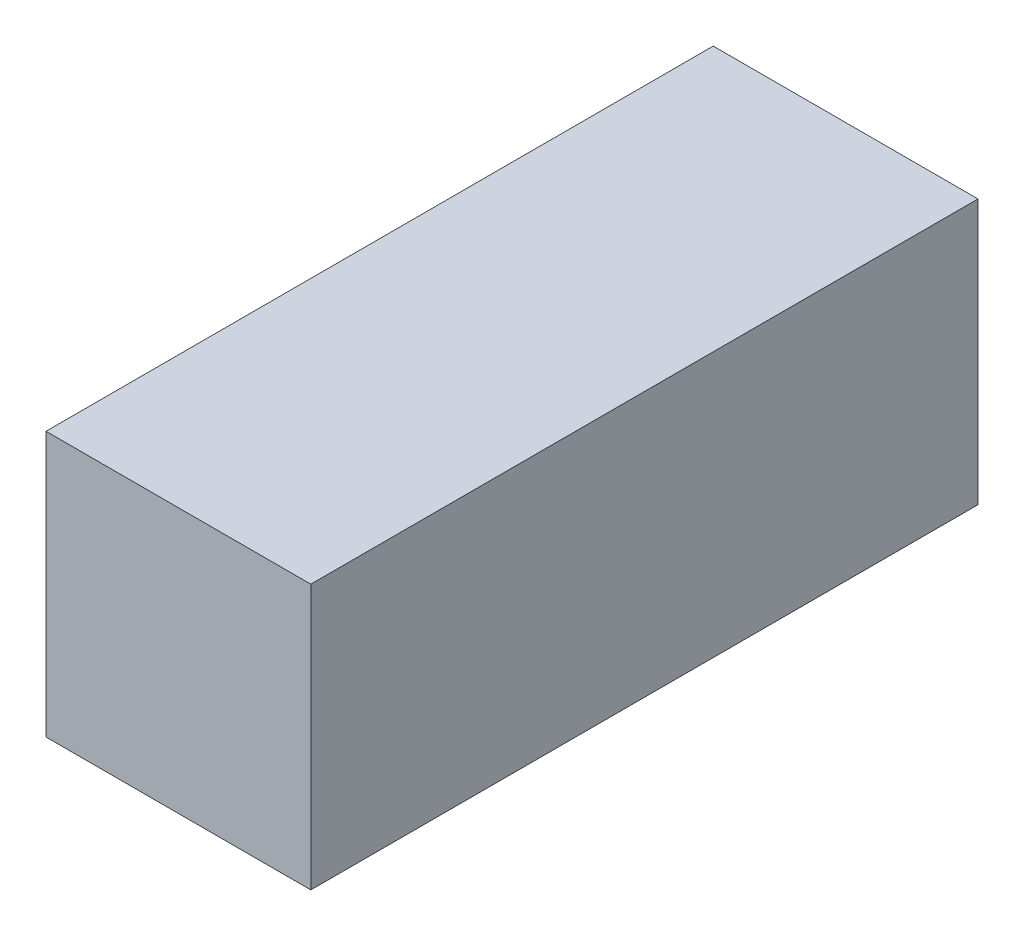
ISO-10303-21;
HEADER;
FILE_DESCRIPTION(('STEP AP214'),'2;1');
FILE_NAME('part.step','',(''),(''),'','','');
FILE_SCHEMA(('AUTOMOTIVE_DESIGN { 1 0 10303 214 1 1 1 1 }'));
ENDSEC;
DATA;
#1=APPLICATION_CONTEXT('core data for automotive mechanical design processes');
#2=APPLICATION_PROTOCOL_DEFINITION('international standard','automotive_design',2000,#1);
#3=PRODUCT_CONTEXT('',#1,'mechanical');
#4=PRODUCT('Part','Part','',(#3));
#5=PRODUCT_RELATED_PRODUCT_CATEGORY('part','',(#4));
#6=PRODUCT_DEFINITION_FORMATION('','',#4);
#7=PRODUCT_DEFINITION_CONTEXT('part definition',#1,'design');
#8=PRODUCT_DEFINITION('design','',#6,#7);
#9=PRODUCT_DEFINITION_SHAPE('','',#8);
#10=(LENGTH_UNIT() NAMED_UNIT(*) SI_UNIT(.MILLI.,.METRE.));
#11=(NAMED_UNIT(*) PLANE_ANGLE_UNIT() SI_UNIT($,.RADIAN.));
#12=(NAMED_UNIT(*) SI_UNIT($,.STERADIAN.) SOLID_ANGLE_UNIT());
#13=UNCERTAINTY_MEASURE_WITH_UNIT(LENGTH_MEASURE(1.E-05),#10,'distance_accuracy_value','');
#14=(GEOMETRIC_REPRESENTATION_CONTEXT(3) GLOBAL_UNCERTAINTY_ASSIGNED_CONTEXT((#13)) GLOBAL_UNIT_ASSIGNED_CONTEXT((#10,
#11,#12)) REPRESENTATION_CONTEXT('',''));
#15=CARTESIAN_POINT('',(0.,0.,0.));
#16=DIRECTION('',(0.,0.,1.));
#17=DIRECTION('',(1.,0.,0.));
#18=AXIS2_PLACEMENT_3D('',#15,#16,#17);
#19=CARTESIAN_POINT('',(8.607,2.2275,-21.));
#20=DIRECTION('',(1.,0.,0.));
#21=DIRECTION('',(0.,0.,-1.));
#22=AXIS2_PLACEMENT_3D('',#19,#20,#21);
#23=PLANE('',#22);
#24=DIRECTION('',(0.,-1.,0.));
#25=VECTOR('',#24,1.);
#26=CARTESIAN_POINT('',(8.607,2.2275,-22.6));
#27=LINE('',#26,#25);
#28=CARTESIAN_POINT('',(8.607,2.2275,-22.6));
#29=VERTEX_POINT('',#28);
#30=CARTESIAN_POINT('',(8.607,1.5925,-22.6));
#31=VERTEX_POINT('',#30);
#32=EDGE_CURVE('E11',#29,#31,#27,.T.);
#33=ORIENTED_EDGE('',*,*,#32,.T.);
#34=DIRECTION('',(0.,0.,-1.));
#35=VECTOR('',#34,1.);
#36=CARTESIAN_POINT('',(8.607,1.5925,-21.));
#37=LINE('',#36,#35);
#38=CARTESIAN_POINT('',(8.607,1.5925,-21.));
#39=VERTEX_POINT('',#38);
#40=EDGE_CURVE('E24',#39,#31,#37,.T.);
#41=ORIENTED_EDGE('',*,*,#40,.F.);
#42=DIRECTION('',(0.,-1.,0.));
#43=VECTOR('',#42,1.);
#44=CARTESIAN_POINT('',(8.607,2.2275,-21.));
#45=LINE('',#44,#43);
#46=CARTESIAN_POINT('',(8.607,2.2275,-21.));
#47=VERTEX_POINT('',#46);
#48=EDGE_CURVE('E88',#47,#39,#45,.T.);
#49=ORIENTED_EDGE('',*,*,#48,.F.);
#50=DIRECTION('',(0.,0.,-1.));
#51=VECTOR('',#50,1.);
#52=CARTESIAN_POINT('',(8.607,2.2275,-21.));
#53=LINE('',#52,#51);
#54=EDGE_CURVE('E77',#47,#29,#53,.T.);
#55=ORIENTED_EDGE('',*,*,#54,.T.);
#56=EDGE_LOOP('',(#33,#41,#49,#55));
#57=FACE_BOUND('',#56,.T.);
#58=ADVANCED_FACE('F17',(#57),#23,.F.);
#59=CARTESIAN_POINT('',(8.607,1.5925,-21.));
#60=DIRECTION('',(0.,1.,0.));
#61=DIRECTION('',(0.,0.,1.));
#62=AXIS2_PLACEMENT_3D('',#59,#60,#61);
#63=PLANE('',#62);
#64=DIRECTION('',(1.,0.,0.));
#65=VECTOR('',#64,1.);
#66=CARTESIAN_POINT('',(8.607,1.5925,-22.6));
#67=LINE('',#66,#65);
#68=CARTESIAN_POINT('',(9.242,1.5925,-22.6));
#69=VERTEX_POINT('',#68);
#70=EDGE_CURVE('E85',#31,#69,#67,.T.);
#71=ORIENTED_EDGE('',*,*,#70,.T.);
#72=DIRECTION('',(0.,0.,-1.));
#73=VECTOR('',#72,1.);
#74=CARTESIAN_POINT('',(9.242,1.5925,-21.));
#75=LINE('',#74,#73);
#76=CARTESIAN_POINT('',(9.242,1.5925,-21.));
#77=VERTEX_POINT('',#76);
#78=EDGE_CURVE('E83',#77,#69,#75,.T.);
#79=ORIENTED_EDGE('',*,*,#78,.F.);
#80=DIRECTION('',(1.,0.,0.));
#81=VECTOR('',#80,1.);
#82=CARTESIAN_POINT('',(8.607,1.5925,-21.));
#83=LINE('',#82,#81);
#84=EDGE_CURVE('E72',#39,#77,#83,.T.);
#85=ORIENTED_EDGE('',*,*,#84,.F.);
#86=ORIENTED_EDGE('',*,*,#40,.T.);
#87=EDGE_LOOP('',(#71,#79,#85,#86));
#88=FACE_BOUND('',#87,.T.);
#89=ADVANCED_FACE('F90',(#88),#63,.F.);
#90=CARTESIAN_POINT('',(9.242,2.2275,-21.));
#91=DIRECTION('',(-1.,0.,0.));
#92=DIRECTION('',(0.,0.,1.));
#93=AXIS2_PLACEMENT_3D('',#90,#91,#92);
#94=PLANE('',#93);
#95=DIRECTION('',(0.,1.,0.));
#96=VECTOR('',#95,1.);
#97=CARTESIAN_POINT('',(9.242,2.2275,-22.6));
#98=LINE('',#97,#96);
#99=CARTESIAN_POINT('',(9.242,2.2275,-22.6));
#100=VERTEX_POINT('',#99);
#101=EDGE_CURVE('E60',#69,#100,#98,.T.);
#102=ORIENTED_EDGE('',*,*,#101,.T.);
#103=DIRECTION('',(0.,0.,-1.));
#104=VECTOR('',#103,1.);
#105=CARTESIAN_POINT('',(9.242,2.2275,-21.));
#106=LINE('',#105,#104);
#107=CARTESIAN_POINT('',(9.242,2.2275,-21.));
#108=VERTEX_POINT('',#107);
#109=EDGE_CURVE('E54',#108,#100,#106,.T.);
#110=ORIENTED_EDGE('',*,*,#109,.F.);
#111=DIRECTION('',(0.,1.,0.));
#112=VECTOR('',#111,1.);
#113=CARTESIAN_POINT('',(9.242,2.2275,-21.));
#114=LINE('',#113,#112);
#115=EDGE_CURVE('E58',#77,#108,#114,.T.);
#116=ORIENTED_EDGE('',*,*,#115,.F.);
#117=ORIENTED_EDGE('',*,*,#78,.T.);
#118=EDGE_LOOP('',(#102,#110,#116,#117));
#119=FACE_BOUND('',#118,.T.);
#120=ADVANCED_FACE('F56',(#119),#94,.F.);
#121=CARTESIAN_POINT('',(8.607,2.2275,-21.));
#122=DIRECTION('',(0.,-1.,0.));
#123=DIRECTION('',(0.,0.,-1.));
#124=AXIS2_PLACEMENT_3D('',#121,#122,#123);
#125=PLANE('',#124);
#126=DIRECTION('',(-1.,0.,0.));
#127=VECTOR('',#126,1.);
#128=CARTESIAN_POINT('',(8.607,2.2275,-22.6));
#129=LINE('',#128,#127);
#130=EDGE_CURVE('E73',#100,#29,#129,.T.);
#131=ORIENTED_EDGE('',*,*,#130,.T.);
#132=ORIENTED_EDGE('',*,*,#54,.F.);
#133=DIRECTION('',(-1.,0.,0.));
#134=VECTOR('',#133,1.);
#135=CARTESIAN_POINT('',(8.607,2.2275,-21.));
#136=LINE('',#135,#134);
#137=EDGE_CURVE('E70',#108,#47,#136,.T.);
#138=ORIENTED_EDGE('',*,*,#137,.F.);
#139=ORIENTED_EDGE('',*,*,#109,.T.);
#140=EDGE_LOOP('',(#131,#132,#138,#139));
#141=FACE_BOUND('',#140,.T.);
#142=ADVANCED_FACE('F76',(#141),#125,.F.);
#143=CARTESIAN_POINT('',(0.,0.,-21.));
#144=DIRECTION('',(0.,0.,1.));
#145=DIRECTION('',(1.,0.,0.));
#146=AXIS2_PLACEMENT_3D('',#143,#144,#145);
#147=PLANE('',#146);
#148=ORIENTED_EDGE('',*,*,#48,.T.);
#149=ORIENTED_EDGE('',*,*,#84,.T.);
#150=ORIENTED_EDGE('',*,*,#115,.T.);
#151=ORIENTED_EDGE('',*,*,#137,.T.);
#152=EDGE_LOOP('',(#148,#149,#150,#151));
#153=FACE_BOUND('',#152,.T.);
#154=ADVANCED_FACE('F69',(#153),#147,.T.);
#155=CARTESIAN_POINT('',(0.,0.,-22.6));
#156=DIRECTION('',(0.,0.,1.));
#157=DIRECTION('',(1.,0.,0.));
#158=AXIS2_PLACEMENT_3D('',#155,#156,#157);
#159=PLANE('',#158);
#160=ORIENTED_EDGE('',*,*,#32,.F.);
#161=ORIENTED_EDGE('',*,*,#130,.F.);
#162=ORIENTED_EDGE('',*,*,#101,.F.);
#163=ORIENTED_EDGE('',*,*,#70,.F.);
#164=EDGE_LOOP('',(#160,#161,#162,#163));
#165=FACE_BOUND('',#164,.T.);
#166=ADVANCED_FACE('F91',(#165),#159,.F.);
#167=CLOSED_SHELL('',(#58,#89,#120,#142,#154,#166));
#168=MANIFOLD_SOLID_BREP('B1',#167);
#169=ADVANCED_BREP_SHAPE_REPRESENTATION('',(#18,#168),#14);
#170=SHAPE_DEFINITION_REPRESENTATION(#9,#169);
ENDSEC;
END-ISO-10303-21;
